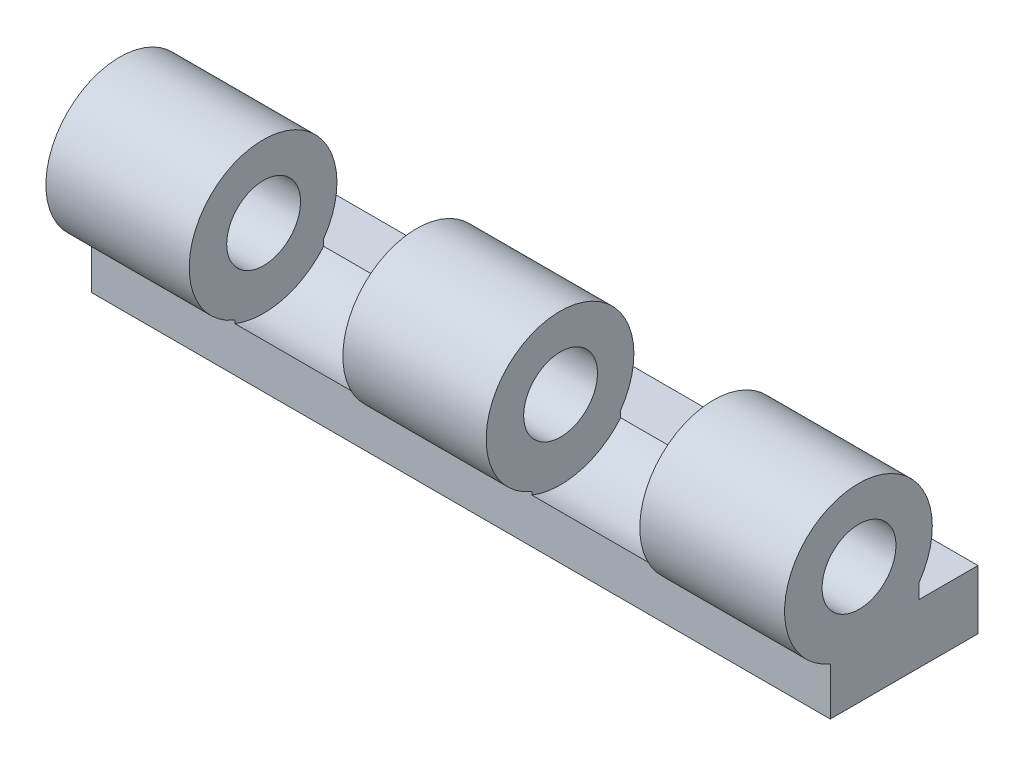
ISO-10303-21;
HEADER;
FILE_DESCRIPTION(('STEP AP214'),'2;1');
FILE_NAME('part.step','',(''),(''),'','','');
FILE_SCHEMA(('AUTOMOTIVE_DESIGN { 1 0 10303 214 1 1 1 1 }'));
ENDSEC;
DATA;
#1=APPLICATION_CONTEXT('core data for automotive mechanical design processes');
#2=APPLICATION_PROTOCOL_DEFINITION('international standard','automotive_design',2000,#1);
#3=PRODUCT_CONTEXT('',#1,'mechanical');
#4=PRODUCT('Part','Part','',(#3));
#5=PRODUCT_RELATED_PRODUCT_CATEGORY('part','',(#4));
#6=PRODUCT_DEFINITION_FORMATION('','',#4);
#7=PRODUCT_DEFINITION_CONTEXT('part definition',#1,'design');
#8=PRODUCT_DEFINITION('design','',#6,#7);
#9=PRODUCT_DEFINITION_SHAPE('','',#8);
#10=(LENGTH_UNIT() NAMED_UNIT(*) SI_UNIT(.MILLI.,.METRE.));
#11=(NAMED_UNIT(*) PLANE_ANGLE_UNIT() SI_UNIT($,.RADIAN.));
#12=(NAMED_UNIT(*) SI_UNIT($,.STERADIAN.) SOLID_ANGLE_UNIT());
#13=UNCERTAINTY_MEASURE_WITH_UNIT(LENGTH_MEASURE(1.E-05),#10,'distance_accuracy_value','');
#14=(GEOMETRIC_REPRESENTATION_CONTEXT(3) GLOBAL_UNCERTAINTY_ASSIGNED_CONTEXT((#13)) GLOBAL_UNIT_ASSIGNED_CONTEXT((#10,
#11,#12)) REPRESENTATION_CONTEXT('',''));
#15=CARTESIAN_POINT('',(0.,0.,0.));
#16=DIRECTION('',(0.,0.,1.));
#17=DIRECTION('',(1.,0.,0.));
#18=AXIS2_PLACEMENT_3D('',#15,#16,#17);
#19=CARTESIAN_POINT('',(0.,0.,50.));
#20=DIRECTION('',(0.,0.,-1.));
#21=DIRECTION('',(-1.,0.,0.));
#22=AXIS2_PLACEMENT_3D('',#19,#20,#21);
#23=PLANE('',#22);
#24=DIRECTION('',(1.,0.,0.));
#25=VECTOR('',#24,1.);
#26=CARTESIAN_POINT('',(134.,15.1423025435834,50.));
#27=LINE('',#26,#25);
#28=CARTESIAN_POINT('',(134.,15.1423025435834,50.));
#29=VERTEX_POINT('',#28);
#30=CARTESIAN_POINT('',(186.,15.1423025435834,50.));
#31=VERTEX_POINT('',#30);
#32=EDGE_CURVE('E313',#29,#31,#27,.T.);
#33=ORIENTED_EDGE('',*,*,#32,.F.);
#34=DIRECTION('',(0.,1.,0.));
#35=VECTOR('',#34,1.);
#36=CARTESIAN_POINT('',(134.,0.,50.));
#37=LINE('',#36,#35);
#38=CARTESIAN_POINT('',(134.,16.172804550582,50.));
#39=VERTEX_POINT('',#38);
#40=EDGE_CURVE('E183',#29,#39,#37,.T.);
#41=ORIENTED_EDGE('',*,*,#40,.T.);
#42=DIRECTION('',(-1.,0.,0.));
#43=VECTOR('',#42,1.);
#44=CARTESIAN_POINT('',(134.5,16.172804550582,50.));
#45=LINE('',#44,#43);
#46=CARTESIAN_POINT('',(85.5,16.172804550582,50.));
#47=VERTEX_POINT('',#46);
#48=EDGE_CURVE('E129',#39,#47,#45,.T.);
#49=ORIENTED_EDGE('',*,*,#48,.T.);
#50=DIRECTION('',(0.,1.,0.));
#51=VECTOR('',#50,1.);
#52=CARTESIAN_POINT('',(85.5,0.,50.));
#53=LINE('',#52,#51);
#54=CARTESIAN_POINT('',(85.5,15.1423025435834,50.));
#55=VERTEX_POINT('',#54);
#56=EDGE_CURVE('E321',#55,#47,#53,.T.);
#57=ORIENTED_EDGE('',*,*,#56,.F.);
#58=DIRECTION('',(1.,0.,0.));
#59=VECTOR('',#58,1.);
#60=CARTESIAN_POINT('',(33.5,15.1423025435834,50.));
#61=LINE('',#60,#59);
#62=CARTESIAN_POINT('',(33.5,15.1423025435834,50.));
#63=VERTEX_POINT('',#62);
#64=EDGE_CURVE('E340',#63,#55,#61,.T.);
#65=ORIENTED_EDGE('',*,*,#64,.F.);
#66=DIRECTION('',(0.,1.,0.));
#67=VECTOR('',#66,1.);
#68=CARTESIAN_POINT('',(33.5,0.,50.));
#69=LINE('',#68,#67);
#70=CARTESIAN_POINT('',(33.5,16.172804550582,50.));
#71=VERTEX_POINT('',#70);
#72=EDGE_CURVE('E332',#63,#71,#69,.T.);
#73=ORIENTED_EDGE('',*,*,#72,.T.);
#74=DIRECTION('',(-1.,0.,0.));
#75=VECTOR('',#74,1.);
#76=CARTESIAN_POINT('',(33.9999999999999,16.172804550582,50.));
#77=LINE('',#76,#75);
#78=CARTESIAN_POINT('',(-15.,16.172804550582,50.));
#79=VERTEX_POINT('',#78);
#80=EDGE_CURVE('E91',#71,#79,#77,.T.);
#81=ORIENTED_EDGE('',*,*,#80,.T.);
#82=DIRECTION('',(0.,1.,0.));
#83=VECTOR('',#82,1.);
#84=CARTESIAN_POINT('',(-15.,0.,50.));
#85=LINE('',#84,#83);
#86=CARTESIAN_POINT('',(-15.,0.,50.));
#87=VERTEX_POINT('',#86);
#88=EDGE_CURVE('E102',#87,#79,#85,.T.);
#89=ORIENTED_EDGE('',*,*,#88,.F.);
#90=DIRECTION('',(1.,0.,0.));
#91=VECTOR('',#90,1.);
#92=CARTESIAN_POINT('',(-15.,0.,50.));
#93=LINE('',#92,#91);
#94=CARTESIAN_POINT('',(235.,0.,50.));
#95=VERTEX_POINT('',#94);
#96=EDGE_CURVE('E88',#87,#95,#93,.T.);
#97=ORIENTED_EDGE('',*,*,#96,.T.);
#98=DIRECTION('',(0.,1.,0.));
#99=VECTOR('',#98,1.);
#100=CARTESIAN_POINT('',(235.,0.,50.));
#101=LINE('',#100,#99);
#102=CARTESIAN_POINT('',(235.,16.172804550582,50.));
#103=VERTEX_POINT('',#102);
#104=EDGE_CURVE('E252',#95,#103,#101,.T.);
#105=ORIENTED_EDGE('',*,*,#104,.T.);
#106=DIRECTION('',(-1.,0.,0.));
#107=VECTOR('',#106,1.);
#108=CARTESIAN_POINT('',(235.,16.172804550582,50.));
#109=LINE('',#108,#107);
#110=CARTESIAN_POINT('',(186.,16.172804550582,50.));
#111=VERTEX_POINT('',#110);
#112=EDGE_CURVE('E278',#103,#111,#109,.T.);
#113=ORIENTED_EDGE('',*,*,#112,.T.);
#114=DIRECTION('',(0.,1.,0.));
#115=VECTOR('',#114,1.);
#116=CARTESIAN_POINT('',(186.,0.,50.));
#117=LINE('',#116,#115);
#118=EDGE_CURVE('E185',#31,#111,#117,.T.);
#119=ORIENTED_EDGE('',*,*,#118,.F.);
#120=EDGE_LOOP('',(#33,#41,#49,#57,#65,#73,#81,#89,#97,#105,#113,#119));
#121=FACE_BOUND('',#120,.T.);
#122=ADVANCED_FACE('F45',(#121),#23,.F.);
#123=CARTESIAN_POINT('',(-15.,0.,50.));
#124=DIRECTION('',(-1.,0.,0.));
#125=DIRECTION('',(0.,0.,1.));
#126=AXIS2_PLACEMENT_3D('',#123,#124,#125);
#127=PLANE('',#126);
#128=DIRECTION('',(0.,1.,0.));
#129=VECTOR('',#128,1.);
#130=CARTESIAN_POINT('',(-15.,20.,19.9430042244693));
#131=LINE('',#130,#129);
#132=CARTESIAN_POINT('',(-15.,20.,19.9430042244693));
#133=VERTEX_POINT('',#132);
#134=CARTESIAN_POINT('',(-15.,25.,19.9430042244693));
#135=VERTEX_POINT('',#134);
#136=EDGE_CURVE('E358',#133,#135,#131,.T.);
#137=ORIENTED_EDGE('',*,*,#136,.F.);
#138=DIRECTION('',(0.,0.,1.));
#139=VECTOR('',#138,1.);
#140=CARTESIAN_POINT('',(-15.,20.,19.9430042244693));
#141=LINE('',#140,#139);
#142=CARTESIAN_POINT('',(-15.,20.,0.));
#143=VERTEX_POINT('',#142);
#144=EDGE_CURVE('E109',#143,#133,#141,.T.);
#145=ORIENTED_EDGE('',*,*,#144,.F.);
#146=DIRECTION('',(0.,1.,0.));
#147=VECTOR('',#146,1.);
#148=CARTESIAN_POINT('',(-15.,0.,0.));
#149=LINE('',#148,#147);
#150=CARTESIAN_POINT('',(-15.,0.,0.));
#151=VERTEX_POINT('',#150);
#152=EDGE_CURVE('E99',#151,#143,#149,.T.);
#153=ORIENTED_EDGE('',*,*,#152,.F.);
#154=DIRECTION('',(0.,0.,-1.));
#155=VECTOR('',#154,1.);
#156=CARTESIAN_POINT('',(-15.,0.,50.));
#157=LINE('',#156,#155);
#158=EDGE_CURVE('E70',#87,#151,#157,.T.);
#159=ORIENTED_EDGE('',*,*,#158,.F.);
#160=ORIENTED_EDGE('',*,*,#88,.T.);
#161=CARTESIAN_POINT('',(-15.,39.2818227022135,40.462008593652));
#162=DIRECTION('',(-1.,0.,0.));
#163=DIRECTION('',(0.,0.,1.));
#164=AXIS2_PLACEMENT_3D('',#161,#162,#163);
#165=CIRCLE('',#164,25.);
#166=EDGE_CURVE('E200',#79,#135,#165,.T.);
#167=ORIENTED_EDGE('',*,*,#166,.T.);
#168=EDGE_LOOP('',(#137,#145,#153,#159,#160,#167));
#169=FACE_BOUND('',#168,.T.);
#170=CARTESIAN_POINT('',(-15.,39.7923685098475,40.2725004313118));
#171=DIRECTION('',(-1.,0.,0.));
#172=DIRECTION('',(0.,0.,1.));
#173=AXIS2_PLACEMENT_3D('',#170,#171,#172);
#174=CIRCLE('',#173,12.5);
#175=CARTESIAN_POINT('',(-15.,39.7923685098475,52.7725004313118));
#176=VERTEX_POINT('',#175);
#177=EDGE_CURVE('E361',#176,#176,#174,.T.);
#178=ORIENTED_EDGE('',*,*,#177,.F.);
#179=EDGE_LOOP('',(#178));
#180=FACE_BOUND('',#179,.T.);
#181=ADVANCED_FACE('F47',(#169,#180),#127,.T.);
#182=CARTESIAN_POINT('',(-15.,0.,50.));
#183=DIRECTION('',(0.,1.,0.));
#184=DIRECTION('',(0.,0.,1.));
#185=AXIS2_PLACEMENT_3D('',#182,#183,#184);
#186=PLANE('',#185);
#187=DIRECTION('',(1.,0.,0.));
#188=VECTOR('',#187,1.);
#189=CARTESIAN_POINT('',(-15.,0.,0.));
#190=LINE('',#189,#188);
#191=CARTESIAN_POINT('',(0.,0.,0.));
#192=VERTEX_POINT('',#191);
#193=EDGE_CURVE('E86',#151,#192,#190,.T.);
#194=ORIENTED_EDGE('',*,*,#193,.T.);
#195=DIRECTION('',(0.,0.,-1.));
#196=VECTOR('',#195,1.);
#197=CARTESIAN_POINT('',(0.,0.,35.));
#198=LINE('',#197,#196);
#199=CARTESIAN_POINT('',(0.,0.,35.));
#200=VERTEX_POINT('',#199);
#201=EDGE_CURVE('E112',#200,#192,#198,.T.);
#202=ORIENTED_EDGE('',*,*,#201,.F.);
#203=DIRECTION('',(-1.,0.,0.));
#204=VECTOR('',#203,1.);
#205=CARTESIAN_POINT('',(0.,0.,35.));
#206=LINE('',#205,#204);
#207=CARTESIAN_POINT('',(220.,0.,35.));
#208=VERTEX_POINT('',#207);
#209=EDGE_CURVE('E228',#208,#200,#206,.T.);
#210=ORIENTED_EDGE('',*,*,#209,.F.);
#211=DIRECTION('',(0.,0.,-1.));
#212=VECTOR('',#211,1.);
#213=CARTESIAN_POINT('',(220.,0.,35.));
#214=LINE('',#213,#212);
#215=CARTESIAN_POINT('',(220.,0.,0.));
#216=VERTEX_POINT('',#215);
#217=EDGE_CURVE('E118',#208,#216,#214,.T.);
#218=ORIENTED_EDGE('',*,*,#217,.T.);
#219=CARTESIAN_POINT('',(235.,0.,0.));
#220=VERTEX_POINT('',#219);
#221=EDGE_CURVE('E103',#216,#220,#190,.T.);
#222=ORIENTED_EDGE('',*,*,#221,.T.);
#223=DIRECTION('',(0.,0.,-1.));
#224=VECTOR('',#223,1.);
#225=CARTESIAN_POINT('',(235.,0.,50.));
#226=LINE('',#225,#224);
#227=EDGE_CURVE('E92',#95,#220,#226,.T.);
#228=ORIENTED_EDGE('',*,*,#227,.F.);
#229=ORIENTED_EDGE('',*,*,#96,.F.);
#230=ORIENTED_EDGE('',*,*,#158,.T.);
#231=EDGE_LOOP('',(#194,#202,#210,#218,#222,#228,#229,#230));
#232=FACE_BOUND('',#231,.T.);
#233=ADVANCED_FACE('F83',(#232),#186,.F.);
#234=CARTESIAN_POINT('',(235.,0.,50.));
#235=DIRECTION('',(-1.,0.,0.));
#236=DIRECTION('',(0.,0.,1.));
#237=AXIS2_PLACEMENT_3D('',#234,#235,#236);
#238=PLANE('',#237);
#239=CARTESIAN_POINT('',(235.,39.7923685098475,40.2725004313118));
#240=DIRECTION('',(-1.,0.,0.));
#241=DIRECTION('',(0.,0.,1.));
#242=AXIS2_PLACEMENT_3D('',#239,#240,#241);
#243=CIRCLE('',#242,12.5);
#244=CARTESIAN_POINT('',(235.,39.7923685098475,52.7725004313118));
#245=VERTEX_POINT('',#244);
#246=EDGE_CURVE('E139',#245,#245,#243,.T.);
#247=ORIENTED_EDGE('',*,*,#246,.T.);
#248=EDGE_LOOP('',(#247));
#249=FACE_BOUND('',#248,.T.);
#250=DIRECTION('',(0.,0.,-1.));
#251=VECTOR('',#250,1.);
#252=CARTESIAN_POINT('',(235.,20.,19.9430042244693));
#253=LINE('',#252,#251);
#254=CARTESIAN_POINT('',(235.,20.,19.9430042244693));
#255=VERTEX_POINT('',#254);
#256=CARTESIAN_POINT('',(235.,20.,0.));
#257=VERTEX_POINT('',#256);
#258=EDGE_CURVE('E350',#255,#257,#253,.T.);
#259=ORIENTED_EDGE('',*,*,#258,.F.);
#260=DIRECTION('',(0.,1.,0.));
#261=VECTOR('',#260,1.);
#262=CARTESIAN_POINT('',(235.,20.,19.9430042244693));
#263=LINE('',#262,#261);
#264=CARTESIAN_POINT('',(235.,25.,19.9430042244693));
#265=VERTEX_POINT('',#264);
#266=EDGE_CURVE('E271',#255,#265,#263,.T.);
#267=ORIENTED_EDGE('',*,*,#266,.T.);
#268=CARTESIAN_POINT('',(235.,39.2818227022135,40.462008593652));
#269=DIRECTION('',(-1.,0.,0.));
#270=DIRECTION('',(0.,0.,1.));
#271=AXIS2_PLACEMENT_3D('',#268,#269,#270);
#272=CIRCLE('',#271,25.);
#273=EDGE_CURVE('E268',#103,#265,#272,.T.);
#274=ORIENTED_EDGE('',*,*,#273,.F.);
#275=ORIENTED_EDGE('',*,*,#104,.F.);
#276=ORIENTED_EDGE('',*,*,#227,.T.);
#277=DIRECTION('',(0.,1.,0.));
#278=VECTOR('',#277,1.);
#279=CARTESIAN_POINT('',(235.,0.,0.));
#280=LINE('',#279,#278);
#281=EDGE_CURVE('E111',#220,#257,#280,.T.);
#282=ORIENTED_EDGE('',*,*,#281,.T.);
#283=EDGE_LOOP('',(#259,#267,#274,#275,#276,#282));
#284=FACE_BOUND('',#283,.T.);
#285=ADVANCED_FACE('F265',(#249,#284),#238,.F.);
#286=CARTESIAN_POINT('',(0.,0.,0.));
#287=DIRECTION('',(0.,0.,-1.));
#288=DIRECTION('',(-1.,0.,0.));
#289=AXIS2_PLACEMENT_3D('',#286,#287,#288);
#290=PLANE('',#289);
#291=DIRECTION('',(-1.,0.,0.));
#292=VECTOR('',#291,1.);
#293=CARTESIAN_POINT('',(-15.,20.,0.));
#294=LINE('',#293,#292);
#295=EDGE_CURVE('E354',#257,#143,#294,.T.);
#296=ORIENTED_EDGE('',*,*,#295,.F.);
#297=ORIENTED_EDGE('',*,*,#281,.F.);
#298=ORIENTED_EDGE('',*,*,#221,.F.);
#299=DIRECTION('',(0.,-1.,0.));
#300=VECTOR('',#299,1.);
#301=CARTESIAN_POINT('',(220.,0.,0.));
#302=LINE('',#301,#300);
#303=CARTESIAN_POINT('',(220.,9.99999999999997,0.));
#304=VERTEX_POINT('',#303);
#305=EDGE_CURVE('E220',#304,#216,#302,.T.);
#306=ORIENTED_EDGE('',*,*,#305,.F.);
#307=DIRECTION('',(1.,0.,0.));
#308=VECTOR('',#307,1.);
#309=CARTESIAN_POINT('',(0.,10.,0.));
#310=LINE('',#309,#308);
#311=CARTESIAN_POINT('',(0.,10.,0.));
#312=VERTEX_POINT('',#311);
#313=EDGE_CURVE('E235',#312,#304,#310,.T.);
#314=ORIENTED_EDGE('',*,*,#313,.F.);
#315=DIRECTION('',(0.,1.,0.));
#316=VECTOR('',#315,1.);
#317=CARTESIAN_POINT('',(0.,0.,0.));
#318=LINE('',#317,#316);
#319=EDGE_CURVE('E61',#192,#312,#318,.T.);
#320=ORIENTED_EDGE('',*,*,#319,.F.);
#321=ORIENTED_EDGE('',*,*,#193,.F.);
#322=ORIENTED_EDGE('',*,*,#152,.T.);
#323=EDGE_LOOP('',(#296,#297,#298,#306,#314,#320,#321,#322));
#324=FACE_BOUND('',#323,.T.);
#325=ADVANCED_FACE('F97',(#324),#290,.T.);
#326=CARTESIAN_POINT('',(0.,0.,35.));
#327=DIRECTION('',(-1.,0.,0.));
#328=DIRECTION('',(0.,0.,1.));
#329=AXIS2_PLACEMENT_3D('',#326,#327,#328);
#330=PLANE('',#329);
#331=ORIENTED_EDGE('',*,*,#319,.T.);
#332=DIRECTION('',(0.,0.,-1.));
#333=VECTOR('',#332,1.);
#334=CARTESIAN_POINT('',(0.,10.,35.));
#335=LINE('',#334,#333);
#336=CARTESIAN_POINT('',(0.,10.,35.));
#337=VERTEX_POINT('',#336);
#338=EDGE_CURVE('E232',#337,#312,#335,.T.);
#339=ORIENTED_EDGE('',*,*,#338,.F.);
#340=DIRECTION('',(0.,1.,0.));
#341=VECTOR('',#340,1.);
#342=CARTESIAN_POINT('',(0.,0.,35.));
#343=LINE('',#342,#341);
#344=EDGE_CURVE('E215',#200,#337,#343,.T.);
#345=ORIENTED_EDGE('',*,*,#344,.F.);
#346=ORIENTED_EDGE('',*,*,#201,.T.);
#347=EDGE_LOOP('',(#331,#339,#345,#346));
#348=FACE_BOUND('',#347,.T.);
#349=ADVANCED_FACE('F387',(#348),#330,.F.);
#350=CARTESIAN_POINT('',(220.,0.,35.));
#351=DIRECTION('',(1.,0.,0.));
#352=DIRECTION('',(0.,0.,-1.));
#353=AXIS2_PLACEMENT_3D('',#350,#351,#352);
#354=PLANE('',#353);
#355=ORIENTED_EDGE('',*,*,#305,.T.);
#356=ORIENTED_EDGE('',*,*,#217,.F.);
#357=DIRECTION('',(0.,-1.,0.));
#358=VECTOR('',#357,1.);
#359=CARTESIAN_POINT('',(220.,0.,35.));
#360=LINE('',#359,#358);
#361=CARTESIAN_POINT('',(220.,9.99999999999997,35.));
#362=VERTEX_POINT('',#361);
#363=EDGE_CURVE('E224',#362,#208,#360,.T.);
#364=ORIENTED_EDGE('',*,*,#363,.F.);
#365=DIRECTION('',(0.,0.,-1.));
#366=VECTOR('',#365,1.);
#367=CARTESIAN_POINT('',(220.,9.99999999999997,35.));
#368=LINE('',#367,#366);
#369=EDGE_CURVE('E245',#362,#304,#368,.T.);
#370=ORIENTED_EDGE('',*,*,#369,.T.);
#371=EDGE_LOOP('',(#355,#356,#364,#370));
#372=FACE_BOUND('',#371,.T.);
#373=ADVANCED_FACE('F474',(#372),#354,.F.);
#374=CARTESIAN_POINT('',(0.,10.,35.));
#375=DIRECTION('',(0.,1.,0.));
#376=DIRECTION('',(-1.,0.,0.));
#377=AXIS2_PLACEMENT_3D('',#374,#375,#376);
#378=PLANE('',#377);
#379=ORIENTED_EDGE('',*,*,#313,.T.);
#380=ORIENTED_EDGE('',*,*,#369,.F.);
#381=DIRECTION('',(1.,0.,0.));
#382=VECTOR('',#381,1.);
#383=CARTESIAN_POINT('',(0.,10.,35.));
#384=LINE('',#383,#382);
#385=EDGE_CURVE('E219',#337,#362,#384,.T.);
#386=ORIENTED_EDGE('',*,*,#385,.F.);
#387=ORIENTED_EDGE('',*,*,#338,.T.);
#388=EDGE_LOOP('',(#379,#380,#386,#387));
#389=FACE_BOUND('',#388,.T.);
#390=ADVANCED_FACE('F509',(#389),#378,.F.);
#391=CARTESIAN_POINT('',(0.,0.,35.));
#392=DIRECTION('',(0.,0.,-1.));
#393=DIRECTION('',(-1.,0.,0.));
#394=AXIS2_PLACEMENT_3D('',#391,#392,#393);
#395=PLANE('',#394);
#396=ORIENTED_EDGE('',*,*,#344,.T.);
#397=ORIENTED_EDGE('',*,*,#385,.T.);
#398=ORIENTED_EDGE('',*,*,#363,.T.);
#399=ORIENTED_EDGE('',*,*,#209,.T.);
#400=EDGE_LOOP('',(#396,#397,#398,#399));
#401=FACE_BOUND('',#400,.T.);
#402=ADVANCED_FACE('F470',(#401),#395,.T.);
#403=CARTESIAN_POINT('',(33.9999999999999,39.2818227022135,40.462008593652));
#404=DIRECTION('',(-1.,0.,0.));
#405=DIRECTION('',(0.,0.,1.));
#406=AXIS2_PLACEMENT_3D('',#403,#404,#405);
#407=CYLINDRICAL_SURFACE('',#406,25.);
#408=CARTESIAN_POINT('',(33.5,39.2818227022135,40.462008593652));
#409=DIRECTION('',(-1.,0.,0.));
#410=DIRECTION('',(0.,0.,1.));
#411=AXIS2_PLACEMENT_3D('',#408,#409,#410);
#412=CIRCLE('',#411,25.);
#413=CARTESIAN_POINT('',(33.5,25.,19.9430042244693));
#414=VERTEX_POINT('',#413);
#415=EDGE_CURVE('E328',#414,#71,#412,.F.);
#416=ORIENTED_EDGE('',*,*,#415,.F.);
#417=DIRECTION('',(-1.,0.,0.));
#418=VECTOR('',#417,1.);
#419=CARTESIAN_POINT('',(33.9999999999999,25.,19.9430042244693));
#420=LINE('',#419,#418);
#421=EDGE_CURVE('E206',#414,#135,#420,.T.);
#422=ORIENTED_EDGE('',*,*,#421,.T.);
#423=ORIENTED_EDGE('',*,*,#166,.F.);
#424=ORIENTED_EDGE('',*,*,#80,.F.);
#425=EDGE_LOOP('',(#416,#422,#423,#424));
#426=FACE_BOUND('',#425,.T.);
#427=ADVANCED_FACE('F504',(#426),#407,.T.);
#428=CARTESIAN_POINT('',(134.5,39.2818227022135,40.462008593652));
#429=DIRECTION('',(-1.,0.,0.));
#430=DIRECTION('',(0.,0.,1.));
#431=AXIS2_PLACEMENT_3D('',#428,#429,#430);
#432=CYLINDRICAL_SURFACE('',#431,25.);
#433=CARTESIAN_POINT('',(134.,39.2818227022135,40.462008593652));
#434=DIRECTION('',(-1.,0.,0.));
#435=DIRECTION('',(0.,0.,1.));
#436=AXIS2_PLACEMENT_3D('',#433,#434,#435);
#437=CIRCLE('',#436,25.);
#438=CARTESIAN_POINT('',(134.,25.,19.9430042244693));
#439=VERTEX_POINT('',#438);
#440=EDGE_CURVE('E301',#439,#39,#437,.F.);
#441=ORIENTED_EDGE('',*,*,#440,.F.);
#442=DIRECTION('',(-1.,0.,0.));
#443=VECTOR('',#442,1.);
#444=CARTESIAN_POINT('',(134.5,25.,19.9430042244693));
#445=LINE('',#444,#443);
#446=CARTESIAN_POINT('',(85.5,25.,19.9430042244693));
#447=VERTEX_POINT('',#446);
#448=EDGE_CURVE('E191',#439,#447,#445,.T.);
#449=ORIENTED_EDGE('',*,*,#448,.T.);
#450=CARTESIAN_POINT('',(85.5,39.2818227022135,40.462008593652));
#451=DIRECTION('',(-1.,0.,0.));
#452=DIRECTION('',(0.,0.,1.));
#453=AXIS2_PLACEMENT_3D('',#450,#451,#452);
#454=CIRCLE('',#453,25.);
#455=EDGE_CURVE('E201',#47,#447,#454,.T.);
#456=ORIENTED_EDGE('',*,*,#455,.F.);
#457=ORIENTED_EDGE('',*,*,#48,.F.);
#458=EDGE_LOOP('',(#441,#449,#456,#457));
#459=FACE_BOUND('',#458,.T.);
#460=ADVANCED_FACE('F498',(#459),#432,.T.);
#461=CARTESIAN_POINT('',(85.5,39.2818227022135,40.462008593652));
#462=DIRECTION('',(-1.,0.,0.));
#463=DIRECTION('',(0.,0.,1.));
#464=AXIS2_PLACEMENT_3D('',#461,#462,#463);
#465=PLANE('',#464);
#466=CARTESIAN_POINT('',(85.5,39.7923685098475,40.2725004313118));
#467=DIRECTION('',(-1.,0.,0.));
#468=DIRECTION('',(0.,0.,1.));
#469=AXIS2_PLACEMENT_3D('',#466,#467,#468);
#470=CIRCLE('',#469,12.5);
#471=CARTESIAN_POINT('',(85.5,39.7923685098475,52.7725004313118));
#472=VERTEX_POINT('',#471);
#473=EDGE_CURVE('E138',#472,#472,#470,.T.);
#474=ORIENTED_EDGE('',*,*,#473,.F.);
#475=EDGE_LOOP('',(#474));
#476=FACE_BOUND('',#475,.T.);
#477=ORIENTED_EDGE('',*,*,#455,.T.);
#478=DIRECTION('',(0.,-1.,0.));
#479=VECTOR('',#478,1.);
#480=CARTESIAN_POINT('',(85.5,20.,19.9430042244693));
#481=LINE('',#480,#479);
#482=CARTESIAN_POINT('',(85.5,22.7934984304576,19.9430042244693));
#483=VERTEX_POINT('',#482);
#484=EDGE_CURVE('E133',#447,#483,#481,.T.);
#485=ORIENTED_EDGE('',*,*,#484,.T.);
#486=CARTESIAN_POINT('',(85.5,39.7923685098475,40.2725004313118));
#487=DIRECTION('',(-1.,0.,0.));
#488=DIRECTION('',(0.,0.,1.));
#489=AXIS2_PLACEMENT_3D('',#486,#487,#488);
#490=CIRCLE('',#489,26.5);
#491=EDGE_CURVE('E316',#483,#55,#490,.T.);
#492=ORIENTED_EDGE('',*,*,#491,.T.);
#493=ORIENTED_EDGE('',*,*,#56,.T.);
#494=EDGE_LOOP('',(#477,#485,#492,#493));
#495=FACE_BOUND('',#494,.T.);
#496=ADVANCED_FACE('F500',(#476,#495),#465,.T.);
#497=CARTESIAN_POINT('',(235.,39.2818227022135,40.462008593652));
#498=DIRECTION('',(-1.,0.,0.));
#499=DIRECTION('',(0.,0.,1.));
#500=AXIS2_PLACEMENT_3D('',#497,#498,#499);
#501=CYLINDRICAL_SURFACE('',#500,25.);
#502=ORIENTED_EDGE('',*,*,#273,.T.);
#503=DIRECTION('',(-1.,0.,0.));
#504=VECTOR('',#503,1.);
#505=CARTESIAN_POINT('',(235.,25.,19.9430042244693));
#506=LINE('',#505,#504);
#507=CARTESIAN_POINT('',(186.,25.,19.9430042244693));
#508=VERTEX_POINT('',#507);
#509=EDGE_CURVE('E208',#265,#508,#506,.T.);
#510=ORIENTED_EDGE('',*,*,#509,.T.);
#511=CARTESIAN_POINT('',(186.,39.2818227022135,40.462008593652));
#512=DIRECTION('',(-1.,0.,0.));
#513=DIRECTION('',(0.,0.,1.));
#514=AXIS2_PLACEMENT_3D('',#511,#512,#513);
#515=CIRCLE('',#514,25.);
#516=EDGE_CURVE('E279',#111,#508,#515,.T.);
#517=ORIENTED_EDGE('',*,*,#516,.F.);
#518=ORIENTED_EDGE('',*,*,#112,.F.);
#519=EDGE_LOOP('',(#502,#510,#517,#518));
#520=FACE_BOUND('',#519,.T.);
#521=ADVANCED_FACE('F291',(#520),#501,.T.);
#522=CARTESIAN_POINT('',(186.,39.2818227022135,40.462008593652));
#523=DIRECTION('',(-1.,0.,0.));
#524=DIRECTION('',(0.,0.,1.));
#525=AXIS2_PLACEMENT_3D('',#522,#523,#524);
#526=PLANE('',#525);
#527=CARTESIAN_POINT('',(186.,39.7923685098475,40.2725004313118));
#528=DIRECTION('',(-1.,0.,0.));
#529=DIRECTION('',(0.,0.,1.));
#530=AXIS2_PLACEMENT_3D('',#527,#528,#529);
#531=CIRCLE('',#530,12.5);
#532=CARTESIAN_POINT('',(186.,39.7923685098475,52.7725004313118));
#533=VERTEX_POINT('',#532);
#534=EDGE_CURVE('E134',#533,#533,#531,.T.);
#535=ORIENTED_EDGE('',*,*,#534,.F.);
#536=EDGE_LOOP('',(#535));
#537=FACE_BOUND('',#536,.T.);
#538=ORIENTED_EDGE('',*,*,#516,.T.);
#539=DIRECTION('',(0.,-1.,0.));
#540=VECTOR('',#539,1.);
#541=CARTESIAN_POINT('',(186.,20.,19.9430042244693));
#542=LINE('',#541,#540);
#543=CARTESIAN_POINT('',(186.,22.7934984304576,19.9430042244693));
#544=VERTEX_POINT('',#543);
#545=EDGE_CURVE('E151',#508,#544,#542,.T.);
#546=ORIENTED_EDGE('',*,*,#545,.T.);
#547=CARTESIAN_POINT('',(186.,39.7923685098475,40.2725004313118));
#548=DIRECTION('',(-1.,0.,0.));
#549=DIRECTION('',(0.,0.,1.));
#550=AXIS2_PLACEMENT_3D('',#547,#548,#549);
#551=CIRCLE('',#550,26.5);
#552=EDGE_CURVE('E169',#544,#31,#551,.T.);
#553=ORIENTED_EDGE('',*,*,#552,.T.);
#554=ORIENTED_EDGE('',*,*,#118,.T.);
#555=EDGE_LOOP('',(#538,#546,#553,#554));
#556=FACE_BOUND('',#555,.T.);
#557=ADVANCED_FACE('F296',(#537,#556),#526,.T.);
#558=CARTESIAN_POINT('',(235.,39.7923685098475,40.2725004313118));
#559=DIRECTION('',(-1.,0.,0.));
#560=DIRECTION('',(0.,0.,1.));
#561=AXIS2_PLACEMENT_3D('',#558,#559,#560);
#562=CYLINDRICAL_SURFACE('',#561,12.5);
#563=ORIENTED_EDGE('',*,*,#534,.T.);
#564=EDGE_LOOP('',(#563));
#565=FACE_BOUND('',#564,.T.);
#566=ORIENTED_EDGE('',*,*,#246,.F.);
#567=EDGE_LOOP('',(#566));
#568=FACE_BOUND('',#567,.T.);
#569=ADVANCED_FACE('F395',(#565,#568),#562,.F.);
#570=CARTESIAN_POINT('',(134.,39.7923685098475,40.2725004313118));
#571=DIRECTION('',(-1.,0.,0.));
#572=DIRECTION('',(0.,0.,1.));
#573=AXIS2_PLACEMENT_3D('',#570,#571,#572);
#574=CIRCLE('',#573,12.5);
#575=CARTESIAN_POINT('',(134.,39.7923685098475,52.7725004313118));
#576=VERTEX_POINT('',#575);
#577=EDGE_CURVE('E309',#576,#576,#574,.F.);
#578=ORIENTED_EDGE('',*,*,#577,.T.);
#579=EDGE_LOOP('',(#578));
#580=FACE_BOUND('',#579,.T.);
#581=ORIENTED_EDGE('',*,*,#473,.T.);
#582=EDGE_LOOP('',(#581));
#583=FACE_BOUND('',#582,.T.);
#584=ADVANCED_FACE('F396',(#580,#583),#562,.F.);
#585=CARTESIAN_POINT('',(33.5,39.7923685098475,40.2725004313118));
#586=DIRECTION('',(-1.,0.,0.));
#587=DIRECTION('',(0.,0.,1.));
#588=AXIS2_PLACEMENT_3D('',#585,#586,#587);
#589=CIRCLE('',#588,12.5);
#590=CARTESIAN_POINT('',(33.5,39.7923685098475,52.7725004313118));
#591=VERTEX_POINT('',#590);
#592=EDGE_CURVE('E336',#591,#591,#589,.F.);
#593=ORIENTED_EDGE('',*,*,#592,.T.);
#594=EDGE_LOOP('',(#593));
#595=FACE_BOUND('',#594,.T.);
#596=ORIENTED_EDGE('',*,*,#177,.T.);
#597=EDGE_LOOP('',(#596));
#598=FACE_BOUND('',#597,.T.);
#599=ADVANCED_FACE('F371',(#595,#598),#562,.F.);
#600=CARTESIAN_POINT('',(-15.,20.,19.9430042244693));
#601=DIRECTION('',(0.,0.,1.));
#602=DIRECTION('',(1.,0.,0.));
#603=AXIS2_PLACEMENT_3D('',#600,#601,#602);
#604=PLANE('',#603);
#605=ORIENTED_EDGE('',*,*,#448,.F.);
#606=DIRECTION('',(0.,-1.,0.));
#607=VECTOR('',#606,1.);
#608=CARTESIAN_POINT('',(134.,20.,19.9430042244693));
#609=LINE('',#608,#607);
#610=CARTESIAN_POINT('',(134.,22.7934984304576,19.9430042244693));
#611=VERTEX_POINT('',#610);
#612=EDGE_CURVE('E11',#439,#611,#609,.T.);
#613=ORIENTED_EDGE('',*,*,#612,.T.);
#614=DIRECTION('',(1.,0.,0.));
#615=VECTOR('',#614,1.);
#616=CARTESIAN_POINT('',(134.,22.7934984304576,19.9430042244693));
#617=LINE('',#616,#615);
#618=EDGE_CURVE('E54',#544,#611,#617,.F.);
#619=ORIENTED_EDGE('',*,*,#618,.F.);
#620=ORIENTED_EDGE('',*,*,#545,.F.);
#621=ORIENTED_EDGE('',*,*,#509,.F.);
#622=ORIENTED_EDGE('',*,*,#266,.F.);
#623=DIRECTION('',(1.,0.,0.));
#624=VECTOR('',#623,1.);
#625=CARTESIAN_POINT('',(-15.,20.,19.9430042244693));
#626=LINE('',#625,#624);
#627=EDGE_CURVE('E346',#133,#255,#626,.T.);
#628=ORIENTED_EDGE('',*,*,#627,.F.);
#629=ORIENTED_EDGE('',*,*,#136,.T.);
#630=ORIENTED_EDGE('',*,*,#421,.F.);
#631=DIRECTION('',(0.,-1.,0.));
#632=VECTOR('',#631,1.);
#633=CARTESIAN_POINT('',(33.5,20.,19.9430042244693));
#634=LINE('',#633,#632);
#635=CARTESIAN_POINT('',(33.5,22.7934984304576,19.9430042244693));
#636=VERTEX_POINT('',#635);
#637=EDGE_CURVE('E147',#414,#636,#634,.T.);
#638=ORIENTED_EDGE('',*,*,#637,.T.);
#639=DIRECTION('',(1.,0.,0.));
#640=VECTOR('',#639,1.);
#641=CARTESIAN_POINT('',(33.5,22.7934984304576,19.9430042244693));
#642=LINE('',#641,#640);
#643=EDGE_CURVE('E143',#483,#636,#642,.F.);
#644=ORIENTED_EDGE('',*,*,#643,.F.);
#645=ORIENTED_EDGE('',*,*,#484,.F.);
#646=EDGE_LOOP('',(#605,#613,#619,#620,#621,#622,#628,#629,#630,#638,#644,#645));
#647=FACE_BOUND('',#646,.T.);
#648=ADVANCED_FACE('F188',(#647),#604,.F.);
#649=CARTESIAN_POINT('',(0.,20.,0.));
#650=DIRECTION('',(0.,-1.,0.));
#651=DIRECTION('',(0.,0.,-1.));
#652=AXIS2_PLACEMENT_3D('',#649,#650,#651);
#653=PLANE('',#652);
#654=ORIENTED_EDGE('',*,*,#144,.T.);
#655=ORIENTED_EDGE('',*,*,#627,.T.);
#656=ORIENTED_EDGE('',*,*,#258,.T.);
#657=ORIENTED_EDGE('',*,*,#295,.T.);
#658=EDGE_LOOP('',(#654,#655,#656,#657));
#659=FACE_BOUND('',#658,.T.);
#660=ADVANCED_FACE('F415',(#659),#653,.F.);
#661=CARTESIAN_POINT('',(33.5,39.7923685098475,40.2725004313118));
#662=DIRECTION('',(1.,0.,0.));
#663=DIRECTION('',(0.,0.,-1.));
#664=AXIS2_PLACEMENT_3D('',#661,#662,#663);
#665=CYLINDRICAL_SURFACE('',#664,26.5);
#666=ORIENTED_EDGE('',*,*,#64,.T.);
#667=ORIENTED_EDGE('',*,*,#491,.F.);
#668=ORIENTED_EDGE('',*,*,#643,.T.);
#669=CARTESIAN_POINT('',(33.5,39.7923685098475,40.2725004313118));
#670=DIRECTION('',(-1.,0.,0.));
#671=DIRECTION('',(0.,0.,1.));
#672=AXIS2_PLACEMENT_3D('',#669,#670,#671);
#673=CIRCLE('',#672,26.5);
#674=EDGE_CURVE('E317',#636,#63,#673,.T.);
#675=ORIENTED_EDGE('',*,*,#674,.T.);
#676=EDGE_LOOP('',(#666,#667,#668,#675));
#677=FACE_BOUND('',#676,.T.);
#678=ADVANCED_FACE('F419',(#677),#665,.F.);
#679=CARTESIAN_POINT('',(33.5,39.7923685098475,40.2725004313118));
#680=DIRECTION('',(-1.,0.,0.));
#681=DIRECTION('',(0.,0.,1.));
#682=AXIS2_PLACEMENT_3D('',#679,#680,#681);
#683=PLANE('',#682);
#684=ORIENTED_EDGE('',*,*,#674,.F.);
#685=ORIENTED_EDGE('',*,*,#637,.F.);
#686=ORIENTED_EDGE('',*,*,#415,.T.);
#687=ORIENTED_EDGE('',*,*,#72,.F.);
#688=EDGE_LOOP('',(#684,#685,#686,#687));
#689=FACE_BOUND('',#688,.T.);
#690=ORIENTED_EDGE('',*,*,#592,.F.);
#691=EDGE_LOOP('',(#690));
#692=FACE_BOUND('',#691,.T.);
#693=ADVANCED_FACE('F418',(#689,#692),#683,.F.);
#694=CARTESIAN_POINT('',(134.,39.7923685098475,40.2725004313118));
#695=DIRECTION('',(1.,0.,0.));
#696=DIRECTION('',(0.,0.,-1.));
#697=AXIS2_PLACEMENT_3D('',#694,#695,#696);
#698=CYLINDRICAL_SURFACE('',#697,26.5);
#699=ORIENTED_EDGE('',*,*,#32,.T.);
#700=ORIENTED_EDGE('',*,*,#552,.F.);
#701=ORIENTED_EDGE('',*,*,#618,.T.);
#702=CARTESIAN_POINT('',(134.,39.7923685098475,40.2725004313118));
#703=DIRECTION('',(-1.,0.,0.));
#704=DIRECTION('',(0.,0.,1.));
#705=AXIS2_PLACEMENT_3D('',#702,#703,#704);
#706=CIRCLE('',#705,26.5);
#707=EDGE_CURVE('E165',#611,#29,#706,.T.);
#708=ORIENTED_EDGE('',*,*,#707,.T.);
#709=EDGE_LOOP('',(#699,#700,#701,#708));
#710=FACE_BOUND('',#709,.T.);
#711=ADVANCED_FACE('F163',(#710),#698,.F.);
#712=CARTESIAN_POINT('',(134.,39.7923685098475,40.2725004313118));
#713=DIRECTION('',(-1.,0.,0.));
#714=DIRECTION('',(0.,0.,1.));
#715=AXIS2_PLACEMENT_3D('',#712,#713,#714);
#716=PLANE('',#715);
#717=ORIENTED_EDGE('',*,*,#707,.F.);
#718=ORIENTED_EDGE('',*,*,#612,.F.);
#719=ORIENTED_EDGE('',*,*,#440,.T.);
#720=ORIENTED_EDGE('',*,*,#40,.F.);
#721=EDGE_LOOP('',(#717,#718,#719,#720));
#722=FACE_BOUND('',#721,.T.);
#723=ORIENTED_EDGE('',*,*,#577,.F.);
#724=EDGE_LOOP('',(#723));
#725=FACE_BOUND('',#724,.T.);
#726=ADVANCED_FACE('F177',(#722,#725),#716,.F.);
#727=CLOSED_SHELL('',(#122,#181,#233,#285,#325,#349,#373,#390,#402,#427,#460,#496,#521,#557,
#569,#584,#599,#648,#660,#678,#693,#711,#726));
#728=MANIFOLD_SOLID_BREP('B2',#727);
#729=ADVANCED_BREP_SHAPE_REPRESENTATION('',(#18,#728),#14);
#730=SHAPE_DEFINITION_REPRESENTATION(#9,#729);
ENDSEC;
END-ISO-10303-21;
